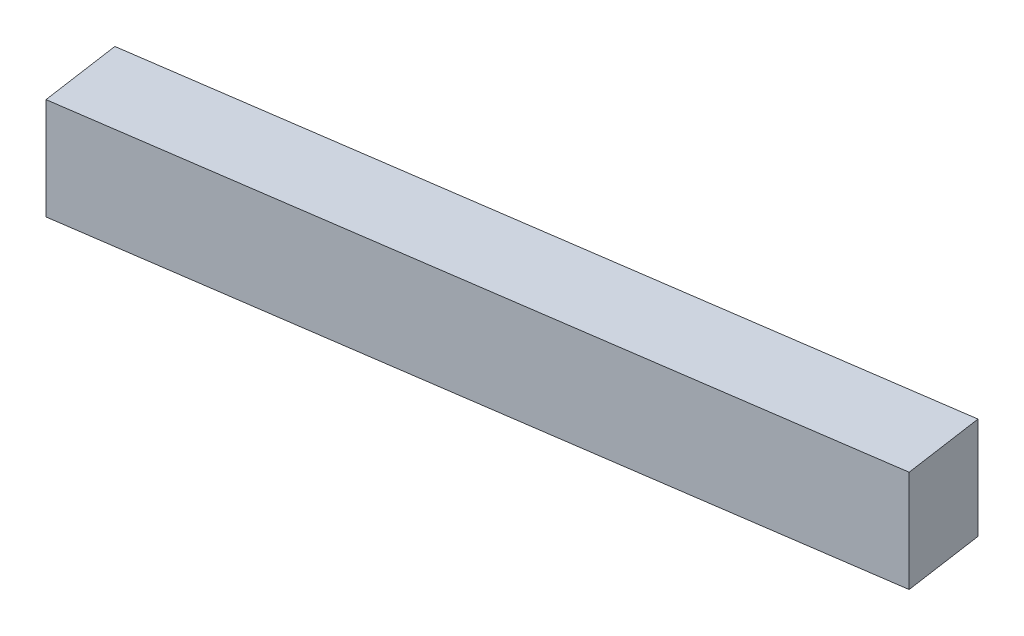
ISO-10303-21;
HEADER;
FILE_DESCRIPTION(('STEP AP214'),'2;1');
FILE_NAME('part.step','',(''),(''),'','','');
FILE_SCHEMA(('AUTOMOTIVE_DESIGN { 1 0 10303 214 1 1 1 1 }'));
ENDSEC;
DATA;
#1=APPLICATION_CONTEXT('core data for automotive mechanical design processes');
#2=APPLICATION_PROTOCOL_DEFINITION('international standard','automotive_design',2000,#1);
#3=PRODUCT_CONTEXT('',#1,'mechanical');
#4=PRODUCT('Part','Part','',(#3));
#5=PRODUCT_RELATED_PRODUCT_CATEGORY('part','',(#4));
#6=PRODUCT_DEFINITION_FORMATION('','',#4);
#7=PRODUCT_DEFINITION_CONTEXT('part definition',#1,'design');
#8=PRODUCT_DEFINITION('design','',#6,#7);
#9=PRODUCT_DEFINITION_SHAPE('','',#8);
#10=(LENGTH_UNIT() NAMED_UNIT(*) SI_UNIT(.MILLI.,.METRE.));
#11=(NAMED_UNIT(*) PLANE_ANGLE_UNIT() SI_UNIT($,.RADIAN.));
#12=(NAMED_UNIT(*) SI_UNIT($,.STERADIAN.) SOLID_ANGLE_UNIT());
#13=UNCERTAINTY_MEASURE_WITH_UNIT(LENGTH_MEASURE(1.E-05),#10,'distance_accuracy_value','');
#14=(GEOMETRIC_REPRESENTATION_CONTEXT(3) GLOBAL_UNCERTAINTY_ASSIGNED_CONTEXT((#13)) GLOBAL_UNIT_ASSIGNED_CONTEXT((#10,
#11,#12)) REPRESENTATION_CONTEXT('',''));
#15=CARTESIAN_POINT('',(0.,0.,0.));
#16=DIRECTION('',(0.,0.,1.));
#17=DIRECTION('',(1.,0.,0.));
#18=AXIS2_PLACEMENT_3D('',#15,#16,#17);
#19=CARTESIAN_POINT('',(-17.7974230262818,7.874,2.6714366402071));
#20=DIRECTION('',(-0.142882293557032,0.,-0.989739688093734));
#21=DIRECTION('',(-0.989739688093734,0.,0.142882293557032));
#22=AXIS2_PLACEMENT_3D('',#19,#20,#21);
#23=PLANE('',#22);
#24=DIRECTION('',(0.,1.,0.));
#25=VECTOR('',#24,1.);
#26=CARTESIAN_POINT('',(-17.7974230262818,7.874,2.6714366402071));
#27=LINE('',#26,#25);
#28=CARTESIAN_POINT('',(-17.7974230262818,7.62,2.6714366402071));
#29=VERTEX_POINT('',#28);
#30=CARTESIAN_POINT('',(-17.7974230262818,7.874,2.6714366402071));
#31=VERTEX_POINT('',#30);
#32=EDGE_CURVE('E20',#29,#31,#27,.T.);
#33=ORIENTED_EDGE('',*,*,#32,.T.);
#34=DIRECTION('',(-0.989739688093734,0.,0.142882293557031));
#35=VECTOR('',#34,1.);
#36=CARTESIAN_POINT('',(-17.7974230262818,7.874,2.6714366402071));
#37=LINE('',#36,#35);
#38=CARTESIAN_POINT('',(-19.6828771321004,7.874,2.94362740943325));
#39=VERTEX_POINT('',#38);
#40=EDGE_CURVE('E55',#31,#39,#37,.T.);
#41=ORIENTED_EDGE('',*,*,#40,.T.);
#42=DIRECTION('',(0.,1.,0.));
#43=VECTOR('',#42,1.);
#44=CARTESIAN_POINT('',(-19.6828771321004,7.874,2.94362740943325));
#45=LINE('',#44,#43);
#46=CARTESIAN_POINT('',(-19.6828771321004,7.62,2.94362740943325));
#47=VERTEX_POINT('',#46);
#48=EDGE_CURVE('E76',#39,#47,#45,.F.);
#49=ORIENTED_EDGE('',*,*,#48,.T.);
#50=DIRECTION('',(-0.989739688093734,0.,0.142882293557031));
#51=VECTOR('',#50,1.);
#52=CARTESIAN_POINT('',(-17.7974230262818,7.62,2.6714366402071));
#53=LINE('',#52,#51);
#54=EDGE_CURVE('E58',#29,#47,#53,.T.);
#55=ORIENTED_EDGE('',*,*,#54,.F.);
#56=EDGE_LOOP('',(#33,#41,#49,#55));
#57=FACE_BOUND('',#56,.T.);
#58=ADVANCED_FACE('F17',(#57),#23,.F.);
#59=CARTESIAN_POINT('',(-17.7974230262818,7.874,2.6714366402071));
#60=DIRECTION('',(-0.98973968809373,0.,0.142882293557063));
#61=DIRECTION('',(0.142882293557063,0.,0.98973968809373));
#62=AXIS2_PLACEMENT_3D('',#59,#60,#61);
#63=PLANE('',#62);
#64=DIRECTION('',(0.,1.,0.));
#65=VECTOR('',#64,1.);
#66=CARTESIAN_POINT('',(-17.8264567083326,7.874,2.47032153558645));
#67=LINE('',#66,#65);
#68=CARTESIAN_POINT('',(-17.8264567083326,7.62,2.47032153558645));
#69=VERTEX_POINT('',#68);
#70=CARTESIAN_POINT('',(-17.8264567083326,7.874,2.47032153558645));
#71=VERTEX_POINT('',#70);
#72=EDGE_CURVE('E73',#69,#71,#67,.T.);
#73=ORIENTED_EDGE('',*,*,#72,.T.);
#74=DIRECTION('',(0.142882293557095,0.,0.989739688093725));
#75=VECTOR('',#74,1.);
#76=CARTESIAN_POINT('',(-17.8264567083326,7.874,2.47032153558645));
#77=LINE('',#76,#75);
#78=EDGE_CURVE('E63',#71,#31,#77,.T.);
#79=ORIENTED_EDGE('',*,*,#78,.T.);
#80=ORIENTED_EDGE('',*,*,#32,.F.);
#81=DIRECTION('',(0.142882293557095,0.,0.989739688093725));
#82=VECTOR('',#81,1.);
#83=CARTESIAN_POINT('',(-17.8264567083326,7.62,2.47032153558645));
#84=LINE('',#83,#82);
#85=EDGE_CURVE('E80',#69,#29,#84,.T.);
#86=ORIENTED_EDGE('',*,*,#85,.F.);
#87=EDGE_LOOP('',(#73,#79,#80,#86));
#88=FACE_BOUND('',#87,.T.);
#89=ADVANCED_FACE('F72',(#88),#63,.F.);
#90=CARTESIAN_POINT('',(-17.7974230262818,7.874,2.6714366402071));
#91=DIRECTION('',(0.,-1.,0.));
#92=DIRECTION('',(0.,0.,-1.));
#93=AXIS2_PLACEMENT_3D('',#90,#91,#92);
#94=PLANE('',#93);
#95=ORIENTED_EDGE('',*,*,#78,.F.);
#96=DIRECTION('',(0.989739688093734,0.,-0.142882293557033));
#97=VECTOR('',#96,1.);
#98=CARTESIAN_POINT('',(-17.8264567083326,7.874,2.47032153558645));
#99=LINE('',#98,#97);
#100=CARTESIAN_POINT('',(-19.7119108144573,7.874,2.7425123048568));
#101=VERTEX_POINT('',#100);
#102=EDGE_CURVE('E83',#71,#101,#99,.F.);
#103=ORIENTED_EDGE('',*,*,#102,.T.);
#104=DIRECTION('',(-0.14288229506373,0.,-0.989739687876222));
#105=VECTOR('',#104,1.);
#106=CARTESIAN_POINT('',(-19.6828771321004,7.874,2.94362740943325));
#107=LINE('',#106,#105);
#108=EDGE_CURVE('E69',#101,#39,#107,.F.);
#109=ORIENTED_EDGE('',*,*,#108,.T.);
#110=ORIENTED_EDGE('',*,*,#40,.F.);
#111=EDGE_LOOP('',(#95,#103,#109,#110));
#112=FACE_BOUND('',#111,.T.);
#113=ADVANCED_FACE('F66',(#112),#94,.F.);
#114=CARTESIAN_POINT('',(-19.6828771321004,7.874,2.94362740943325));
#115=DIRECTION('',(0.989739687876222,0.,-0.14288229506373));
#116=DIRECTION('',(-0.14288229506373,0.,-0.989739687876222));
#117=AXIS2_PLACEMENT_3D('',#114,#115,#116);
#118=PLANE('',#117);
#119=ORIENTED_EDGE('',*,*,#48,.F.);
#120=ORIENTED_EDGE('',*,*,#108,.F.);
#121=DIRECTION('',(0.,1.,0.));
#122=VECTOR('',#121,1.);
#123=CARTESIAN_POINT('',(-19.7119108144573,7.874,2.74251230485679));
#124=LINE('',#123,#122);
#125=CARTESIAN_POINT('',(-19.7119108144573,7.62,2.7425123048568));
#126=VERTEX_POINT('',#125);
#127=EDGE_CURVE('E26',#101,#126,#124,.F.);
#128=ORIENTED_EDGE('',*,*,#127,.T.);
#129=DIRECTION('',(-0.142882295063494,0.,-0.989739687876256));
#130=VECTOR('',#129,1.);
#131=CARTESIAN_POINT('',(-19.6828771321004,7.62,2.94362740943325));
#132=LINE('',#131,#130);
#133=EDGE_CURVE('E34',#47,#126,#132,.T.);
#134=ORIENTED_EDGE('',*,*,#133,.F.);
#135=EDGE_LOOP('',(#119,#120,#128,#134));
#136=FACE_BOUND('',#135,.T.);
#137=ADVANCED_FACE('F88',(#136),#118,.F.);
#138=CARTESIAN_POINT('',(-17.7974230262818,7.62,2.6714366402071));
#139=DIRECTION('',(0.,-1.,0.));
#140=DIRECTION('',(0.,0.,-1.));
#141=AXIS2_PLACEMENT_3D('',#138,#139,#140);
#142=PLANE('',#141);
#143=DIRECTION('',(0.989739688093734,0.,-0.142882293557033));
#144=VECTOR('',#143,1.);
#145=CARTESIAN_POINT('',(-17.8264567083326,7.62,2.47032153558645));
#146=LINE('',#145,#144);
#147=EDGE_CURVE('E11',#126,#69,#146,.T.);
#148=ORIENTED_EDGE('',*,*,#147,.T.);
#149=ORIENTED_EDGE('',*,*,#85,.T.);
#150=ORIENTED_EDGE('',*,*,#54,.T.);
#151=ORIENTED_EDGE('',*,*,#133,.T.);
#152=EDGE_LOOP('',(#148,#149,#150,#151));
#153=FACE_BOUND('',#152,.T.);
#154=ADVANCED_FACE('F91',(#153),#142,.T.);
#155=CARTESIAN_POINT('',(-17.8264567083326,7.874,2.47032153558645));
#156=DIRECTION('',(0.142882293557033,0.,0.989739688093734));
#157=DIRECTION('',(0.989739688093734,0.,-0.142882293557033));
#158=AXIS2_PLACEMENT_3D('',#155,#156,#157);
#159=PLANE('',#158);
#160=ORIENTED_EDGE('',*,*,#127,.F.);
#161=ORIENTED_EDGE('',*,*,#102,.F.);
#162=ORIENTED_EDGE('',*,*,#72,.F.);
#163=ORIENTED_EDGE('',*,*,#147,.F.);
#164=EDGE_LOOP('',(#160,#161,#162,#163));
#165=FACE_BOUND('',#164,.T.);
#166=ADVANCED_FACE('F90',(#165),#159,.F.);
#167=CLOSED_SHELL('',(#58,#89,#113,#137,#154,#166));
#168=MANIFOLD_SOLID_BREP('B1',#167);
#169=ADVANCED_BREP_SHAPE_REPRESENTATION('',(#18,#168),#14);
#170=SHAPE_DEFINITION_REPRESENTATION(#9,#169);
ENDSEC;
END-ISO-10303-21;
